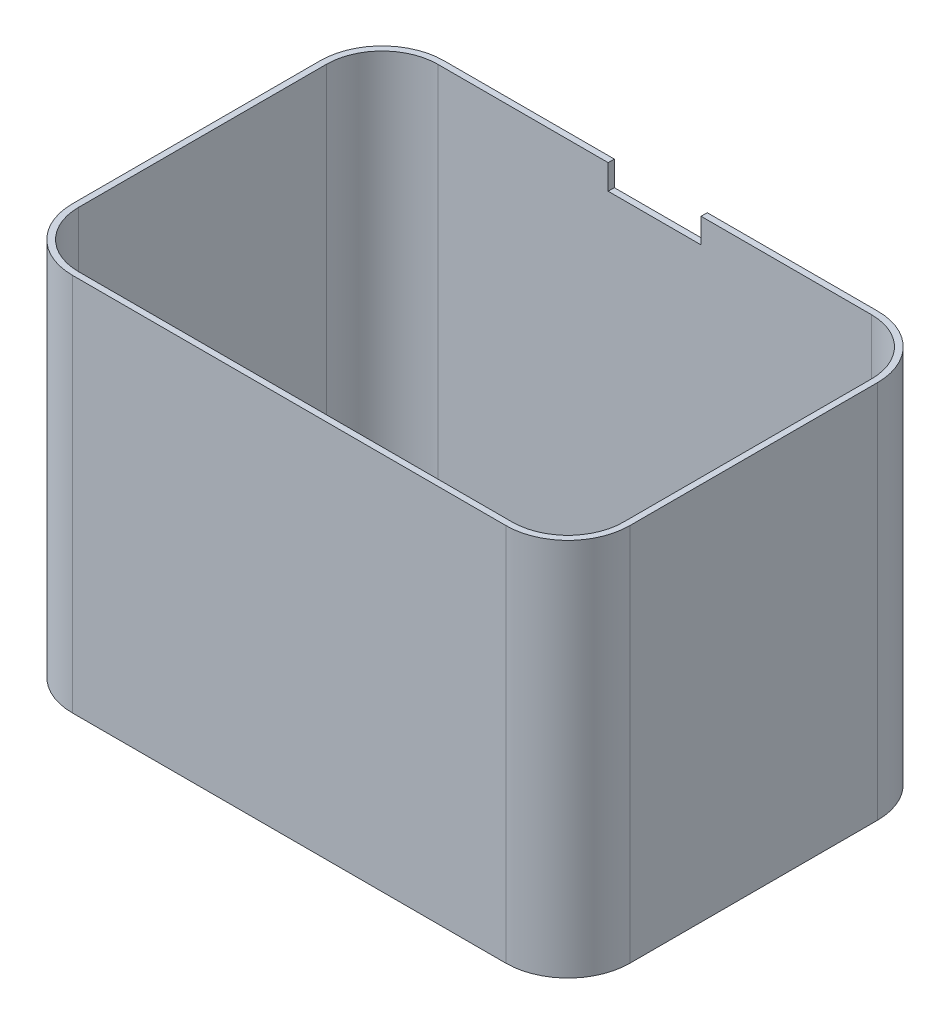
ISO-10303-21;
HEADER;
FILE_DESCRIPTION(('STEP AP214'),'2;1');
FILE_NAME('part.step','',(''),(''),'','','');
FILE_SCHEMA(('AUTOMOTIVE_DESIGN { 1 0 10303 214 1 1 1 1 }'));
ENDSEC;
DATA;
#1=APPLICATION_CONTEXT('core data for automotive mechanical design processes');
#2=APPLICATION_PROTOCOL_DEFINITION('international standard','automotive_design',2000,#1);
#3=PRODUCT_CONTEXT('',#1,'mechanical');
#4=PRODUCT('Part','Part','',(#3));
#5=PRODUCT_RELATED_PRODUCT_CATEGORY('part','',(#4));
#6=PRODUCT_DEFINITION_FORMATION('','',#4);
#7=PRODUCT_DEFINITION_CONTEXT('part definition',#1,'design');
#8=PRODUCT_DEFINITION('design','',#6,#7);
#9=PRODUCT_DEFINITION_SHAPE('','',#8);
#10=(LENGTH_UNIT() NAMED_UNIT(*) SI_UNIT(.MILLI.,.METRE.));
#11=(NAMED_UNIT(*) PLANE_ANGLE_UNIT() SI_UNIT($,.RADIAN.));
#12=(NAMED_UNIT(*) SI_UNIT($,.STERADIAN.) SOLID_ANGLE_UNIT());
#13=UNCERTAINTY_MEASURE_WITH_UNIT(LENGTH_MEASURE(1.E-05),#10,'distance_accuracy_value','');
#14=(GEOMETRIC_REPRESENTATION_CONTEXT(3) GLOBAL_UNCERTAINTY_ASSIGNED_CONTEXT((#13)) GLOBAL_UNIT_ASSIGNED_CONTEXT((#10,
#11,#12)) REPRESENTATION_CONTEXT('',''));
#15=CARTESIAN_POINT('',(0.,0.,0.));
#16=DIRECTION('',(0.,0.,1.));
#17=DIRECTION('',(1.,0.,0.));
#18=AXIS2_PLACEMENT_3D('',#15,#16,#17);
#19=CARTESIAN_POINT('',(-35.,1.2,-20.));
#20=DIRECTION('',(0.,-1.,0.));
#21=DIRECTION('',(0.,0.,-1.));
#22=AXIS2_PLACEMENT_3D('',#19,#20,#21);
#23=CYLINDRICAL_SURFACE('',#22,10.);
#24=CARTESIAN_POINT('',(-35.,0.,-20.));
#25=DIRECTION('',(0.,1.,0.));
#26=DIRECTION('',(0.,0.,1.));
#27=AXIS2_PLACEMENT_3D('',#24,#25,#26);
#28=CIRCLE('',#27,10.);
#29=CARTESIAN_POINT('',(-34.9999999999999,0.,-30.));
#30=VERTEX_POINT('',#29);
#31=CARTESIAN_POINT('',(-45.,0.,-19.9999999999999));
#32=VERTEX_POINT('',#31);
#33=EDGE_CURVE('E282',#30,#32,#28,.T.);
#34=ORIENTED_EDGE('',*,*,#33,.T.);
#35=DIRECTION('',(0.,-1.,0.));
#36=VECTOR('',#35,1.);
#37=CARTESIAN_POINT('',(-45.,1.2,-19.9999999999999));
#38=LINE('',#37,#36);
#39=CARTESIAN_POINT('',(-45.,61.2,-19.9999999999999));
#40=VERTEX_POINT('',#39);
#41=EDGE_CURVE('E320',#40,#32,#38,.T.);
#42=ORIENTED_EDGE('',*,*,#41,.F.);
#43=CARTESIAN_POINT('',(-35.,61.2,-20.));
#44=DIRECTION('',(0.,1.,0.));
#45=DIRECTION('',(0.,0.,1.));
#46=AXIS2_PLACEMENT_3D('',#43,#44,#45);
#47=CIRCLE('',#46,10.);
#48=CARTESIAN_POINT('',(-34.9999999999999,61.2,-30.));
#49=VERTEX_POINT('',#48);
#50=EDGE_CURVE('E264',#49,#40,#47,.T.);
#51=ORIENTED_EDGE('',*,*,#50,.F.);
#52=DIRECTION('',(0.,-1.,0.));
#53=VECTOR('',#52,1.);
#54=CARTESIAN_POINT('',(-34.9999999999999,1.2,-30.));
#55=LINE('',#54,#53);
#56=EDGE_CURVE('E299',#49,#30,#55,.T.);
#57=ORIENTED_EDGE('',*,*,#56,.T.);
#58=EDGE_LOOP('',(#34,#42,#51,#57));
#59=FACE_BOUND('',#58,.T.);
#60=ADVANCED_FACE('F38',(#59),#23,.T.);
#61=CARTESIAN_POINT('',(-45.,1.2,-19.9999999999999));
#62=DIRECTION('',(1.,0.,0.));
#63=DIRECTION('',(0.,0.,-1.));
#64=AXIS2_PLACEMENT_3D('',#61,#62,#63);
#65=PLANE('',#64);
#66=DIRECTION('',(0.,0.,1.));
#67=VECTOR('',#66,1.);
#68=CARTESIAN_POINT('',(-45.,0.,-19.9999999999999));
#69=LINE('',#68,#67);
#70=CARTESIAN_POINT('',(-45.,0.,19.9999999999999));
#71=VERTEX_POINT('',#70);
#72=EDGE_CURVE('E285',#32,#71,#69,.T.);
#73=ORIENTED_EDGE('',*,*,#72,.T.);
#74=DIRECTION('',(0.,-1.,0.));
#75=VECTOR('',#74,1.);
#76=CARTESIAN_POINT('',(-45.,1.2,19.9999999999999));
#77=LINE('',#76,#75);
#78=CARTESIAN_POINT('',(-45.,61.2,19.9999999999999));
#79=VERTEX_POINT('',#78);
#80=EDGE_CURVE('E317',#79,#71,#77,.T.);
#81=ORIENTED_EDGE('',*,*,#80,.F.);
#82=DIRECTION('',(0.,0.,1.));
#83=VECTOR('',#82,1.);
#84=CARTESIAN_POINT('',(-45.,61.2,-19.9999999999999));
#85=LINE('',#84,#83);
#86=EDGE_CURVE('E267',#40,#79,#85,.T.);
#87=ORIENTED_EDGE('',*,*,#86,.F.);
#88=ORIENTED_EDGE('',*,*,#41,.T.);
#89=EDGE_LOOP('',(#73,#81,#87,#88));
#90=FACE_BOUND('',#89,.T.);
#91=ADVANCED_FACE('F381',(#90),#65,.F.);
#92=CARTESIAN_POINT('',(-35.,1.2,20.));
#93=DIRECTION('',(0.,-1.,0.));
#94=DIRECTION('',(0.,0.,-1.));
#95=AXIS2_PLACEMENT_3D('',#92,#93,#94);
#96=CYLINDRICAL_SURFACE('',#95,10.);
#97=CARTESIAN_POINT('',(-35.,0.,20.));
#98=DIRECTION('',(0.,1.,0.));
#99=DIRECTION('',(0.,0.,1.));
#100=AXIS2_PLACEMENT_3D('',#97,#98,#99);
#101=CIRCLE('',#100,10.);
#102=CARTESIAN_POINT('',(-34.9999999999999,0.,30.));
#103=VERTEX_POINT('',#102);
#104=EDGE_CURVE('E287',#71,#103,#101,.T.);
#105=ORIENTED_EDGE('',*,*,#104,.T.);
#106=DIRECTION('',(0.,-1.,0.));
#107=VECTOR('',#106,1.);
#108=CARTESIAN_POINT('',(-34.9999999999999,1.2,30.));
#109=LINE('',#108,#107);
#110=CARTESIAN_POINT('',(-35.,61.2,30.));
#111=VERTEX_POINT('',#110);
#112=EDGE_CURVE('E314',#111,#103,#109,.T.);
#113=ORIENTED_EDGE('',*,*,#112,.F.);
#114=CARTESIAN_POINT('',(-35.,61.2,20.));
#115=DIRECTION('',(0.,1.,0.));
#116=DIRECTION('',(0.,0.,1.));
#117=AXIS2_PLACEMENT_3D('',#114,#115,#116);
#118=CIRCLE('',#117,9.99999999999999);
#119=EDGE_CURVE('E270',#79,#111,#118,.T.);
#120=ORIENTED_EDGE('',*,*,#119,.F.);
#121=ORIENTED_EDGE('',*,*,#80,.T.);
#122=EDGE_LOOP('',(#105,#113,#120,#121));
#123=FACE_BOUND('',#122,.T.);
#124=ADVANCED_FACE('F387',(#123),#96,.T.);
#125=CARTESIAN_POINT('',(-34.9999999999999,1.2,30.));
#126=DIRECTION('',(0.,0.,-1.));
#127=DIRECTION('',(-1.,0.,0.));
#128=AXIS2_PLACEMENT_3D('',#125,#126,#127);
#129=PLANE('',#128);
#130=DIRECTION('',(1.,0.,0.));
#131=VECTOR('',#130,1.);
#132=CARTESIAN_POINT('',(-34.9999999999999,0.,30.));
#133=LINE('',#132,#131);
#134=CARTESIAN_POINT('',(34.9999999999999,0.,30.));
#135=VERTEX_POINT('',#134);
#136=EDGE_CURVE('E289',#103,#135,#133,.T.);
#137=ORIENTED_EDGE('',*,*,#136,.T.);
#138=DIRECTION('',(0.,-1.,0.));
#139=VECTOR('',#138,1.);
#140=CARTESIAN_POINT('',(34.9999999999999,1.2,30.));
#141=LINE('',#140,#139);
#142=CARTESIAN_POINT('',(34.9999999999999,61.2,30.));
#143=VERTEX_POINT('',#142);
#144=EDGE_CURVE('E311',#143,#135,#141,.T.);
#145=ORIENTED_EDGE('',*,*,#144,.F.);
#146=DIRECTION('',(1.,0.,0.));
#147=VECTOR('',#146,1.);
#148=CARTESIAN_POINT('',(-35.,61.2,30.));
#149=LINE('',#148,#147);
#150=EDGE_CURVE('E273',#111,#143,#149,.T.);
#151=ORIENTED_EDGE('',*,*,#150,.F.);
#152=ORIENTED_EDGE('',*,*,#112,.T.);
#153=EDGE_LOOP('',(#137,#145,#151,#152));
#154=FACE_BOUND('',#153,.T.);
#155=ADVANCED_FACE('F403',(#154),#129,.F.);
#156=CARTESIAN_POINT('',(35.,1.2,20.));
#157=DIRECTION('',(0.,-1.,0.));
#158=DIRECTION('',(0.,0.,-1.));
#159=AXIS2_PLACEMENT_3D('',#156,#157,#158);
#160=CYLINDRICAL_SURFACE('',#159,10.);
#161=CARTESIAN_POINT('',(35.,0.,20.));
#162=DIRECTION('',(0.,1.,0.));
#163=DIRECTION('',(0.,0.,1.));
#164=AXIS2_PLACEMENT_3D('',#161,#162,#163);
#165=CIRCLE('',#164,10.);
#166=CARTESIAN_POINT('',(45.,0.,19.9999999999999));
#167=VERTEX_POINT('',#166);
#168=EDGE_CURVE('E291',#135,#167,#165,.T.);
#169=ORIENTED_EDGE('',*,*,#168,.T.);
#170=DIRECTION('',(0.,-1.,0.));
#171=VECTOR('',#170,1.);
#172=CARTESIAN_POINT('',(45.,1.2,19.9999999999999));
#173=LINE('',#172,#171);
#174=CARTESIAN_POINT('',(45.,61.2,20.));
#175=VERTEX_POINT('',#174);
#176=EDGE_CURVE('E308',#175,#167,#173,.T.);
#177=ORIENTED_EDGE('',*,*,#176,.F.);
#178=CARTESIAN_POINT('',(35.,61.2,20.));
#179=DIRECTION('',(0.,1.,0.));
#180=DIRECTION('',(0.,0.,1.));
#181=AXIS2_PLACEMENT_3D('',#178,#179,#180);
#182=CIRCLE('',#181,10.);
#183=EDGE_CURVE('E276',#143,#175,#182,.T.);
#184=ORIENTED_EDGE('',*,*,#183,.F.);
#185=ORIENTED_EDGE('',*,*,#144,.T.);
#186=EDGE_LOOP('',(#169,#177,#184,#185));
#187=FACE_BOUND('',#186,.T.);
#188=ADVANCED_FACE('F407',(#187),#160,.T.);
#189=CARTESIAN_POINT('',(45.,1.2,-19.9999999999999));
#190=DIRECTION('',(-1.,0.,0.));
#191=DIRECTION('',(0.,0.,1.));
#192=AXIS2_PLACEMENT_3D('',#189,#190,#191);
#193=PLANE('',#192);
#194=DIRECTION('',(0.,0.,-1.));
#195=VECTOR('',#194,1.);
#196=CARTESIAN_POINT('',(45.,0.,-19.9999999999999));
#197=LINE('',#196,#195);
#198=CARTESIAN_POINT('',(45.,0.,-19.9999999999999));
#199=VERTEX_POINT('',#198);
#200=EDGE_CURVE('E293',#167,#199,#197,.T.);
#201=ORIENTED_EDGE('',*,*,#200,.T.);
#202=DIRECTION('',(0.,-1.,0.));
#203=VECTOR('',#202,1.);
#204=CARTESIAN_POINT('',(45.,1.2,-19.9999999999999));
#205=LINE('',#204,#203);
#206=CARTESIAN_POINT('',(45.,61.2,-19.9999999999999));
#207=VERTEX_POINT('',#206);
#208=EDGE_CURVE('E305',#207,#199,#205,.T.);
#209=ORIENTED_EDGE('',*,*,#208,.F.);
#210=DIRECTION('',(0.,0.,-1.));
#211=VECTOR('',#210,1.);
#212=CARTESIAN_POINT('',(45.,61.2,20.));
#213=LINE('',#212,#211);
#214=EDGE_CURVE('E279',#175,#207,#213,.T.);
#215=ORIENTED_EDGE('',*,*,#214,.F.);
#216=ORIENTED_EDGE('',*,*,#176,.T.);
#217=EDGE_LOOP('',(#201,#209,#215,#216));
#218=FACE_BOUND('',#217,.T.);
#219=ADVANCED_FACE('F411',(#218),#193,.F.);
#220=CARTESIAN_POINT('',(35.,1.2,-20.));
#221=DIRECTION('',(0.,-1.,0.));
#222=DIRECTION('',(0.,0.,-1.));
#223=AXIS2_PLACEMENT_3D('',#220,#221,#222);
#224=CYLINDRICAL_SURFACE('',#223,10.);
#225=CARTESIAN_POINT('',(35.,0.,-20.));
#226=DIRECTION('',(0.,1.,0.));
#227=DIRECTION('',(0.,0.,-1.));
#228=AXIS2_PLACEMENT_3D('',#225,#226,#227);
#229=CIRCLE('',#228,10.);
#230=CARTESIAN_POINT('',(34.9999999999999,0.,-30.));
#231=VERTEX_POINT('',#230);
#232=EDGE_CURVE('E295',#199,#231,#229,.T.);
#233=ORIENTED_EDGE('',*,*,#232,.T.);
#234=DIRECTION('',(0.,-1.,0.));
#235=VECTOR('',#234,1.);
#236=CARTESIAN_POINT('',(34.9999999999999,1.2,-30.));
#237=LINE('',#236,#235);
#238=CARTESIAN_POINT('',(34.9999999999999,61.2,-30.));
#239=VERTEX_POINT('',#238);
#240=EDGE_CURVE('E302',#239,#231,#237,.T.);
#241=ORIENTED_EDGE('',*,*,#240,.F.);
#242=CARTESIAN_POINT('',(35.,61.2,-20.));
#243=DIRECTION('',(0.,1.,0.));
#244=DIRECTION('',(0.,0.,1.));
#245=AXIS2_PLACEMENT_3D('',#242,#243,#244);
#246=CIRCLE('',#245,10.);
#247=EDGE_CURVE('E258',#207,#239,#246,.T.);
#248=ORIENTED_EDGE('',*,*,#247,.F.);
#249=ORIENTED_EDGE('',*,*,#208,.T.);
#250=EDGE_LOOP('',(#233,#241,#248,#249));
#251=FACE_BOUND('',#250,.T.);
#252=ADVANCED_FACE('F414',(#251),#224,.T.);
#253=CARTESIAN_POINT('',(-34.9999999999999,1.2,-30.));
#254=DIRECTION('',(0.,0.,1.));
#255=DIRECTION('',(1.,0.,0.));
#256=AXIS2_PLACEMENT_3D('',#253,#254,#255);
#257=PLANE('',#256);
#258=DIRECTION('',(-1.,0.,0.));
#259=VECTOR('',#258,1.);
#260=CARTESIAN_POINT('',(34.9999999999999,61.2,-30.));
#261=LINE('',#260,#259);
#262=CARTESIAN_POINT('',(-7.5,61.2,-30.));
#263=VERTEX_POINT('',#262);
#264=EDGE_CURVE('E261',#263,#49,#261,.T.);
#265=ORIENTED_EDGE('',*,*,#264,.F.);
#266=DIRECTION('',(0.,1.,0.));
#267=VECTOR('',#266,1.);
#268=CARTESIAN_POINT('',(-7.5,65.2,-30.));
#269=LINE('',#268,#267);
#270=CARTESIAN_POINT('',(-7.5,57.2,-30.));
#271=VERTEX_POINT('',#270);
#272=EDGE_CURVE('E189',#271,#263,#269,.T.);
#273=ORIENTED_EDGE('',*,*,#272,.F.);
#274=DIRECTION('',(-1.,0.,0.));
#275=VECTOR('',#274,1.);
#276=CARTESIAN_POINT('',(7.5,57.2,-30.));
#277=LINE('',#276,#275);
#278=CARTESIAN_POINT('',(7.5,57.2,-30.));
#279=VERTEX_POINT('',#278);
#280=EDGE_CURVE('E175',#279,#271,#277,.T.);
#281=ORIENTED_EDGE('',*,*,#280,.F.);
#282=DIRECTION('',(0.,-1.,0.));
#283=VECTOR('',#282,1.);
#284=CARTESIAN_POINT('',(7.5,65.2,-30.));
#285=LINE('',#284,#283);
#286=CARTESIAN_POINT('',(7.5,61.2,-30.));
#287=VERTEX_POINT('',#286);
#288=EDGE_CURVE('E182',#287,#279,#285,.T.);
#289=ORIENTED_EDGE('',*,*,#288,.F.);
#290=EDGE_CURVE('E262',#239,#287,#261,.T.);
#291=ORIENTED_EDGE('',*,*,#290,.F.);
#292=ORIENTED_EDGE('',*,*,#240,.T.);
#293=DIRECTION('',(-1.,0.,0.));
#294=VECTOR('',#293,1.);
#295=CARTESIAN_POINT('',(-34.9999999999999,0.,-30.));
#296=LINE('',#295,#294);
#297=EDGE_CURVE('E297',#231,#30,#296,.T.);
#298=ORIENTED_EDGE('',*,*,#297,.T.);
#299=ORIENTED_EDGE('',*,*,#56,.F.);
#300=EDGE_LOOP('',(#265,#273,#281,#289,#291,#292,#298,#299));
#301=FACE_BOUND('',#300,.T.);
#302=ADVANCED_FACE('F192',(#301),#257,.F.);
#303=CARTESIAN_POINT('',(-35.,0.,-20.));
#304=DIRECTION('',(0.,1.,0.));
#305=DIRECTION('',(0.,0.,1.));
#306=AXIS2_PLACEMENT_3D('',#303,#304,#305);
#307=PLANE('',#306);
#308=ORIENTED_EDGE('',*,*,#33,.F.);
#309=ORIENTED_EDGE('',*,*,#297,.F.);
#310=ORIENTED_EDGE('',*,*,#232,.F.);
#311=ORIENTED_EDGE('',*,*,#200,.F.);
#312=ORIENTED_EDGE('',*,*,#168,.F.);
#313=ORIENTED_EDGE('',*,*,#136,.F.);
#314=ORIENTED_EDGE('',*,*,#104,.F.);
#315=ORIENTED_EDGE('',*,*,#72,.F.);
#316=EDGE_LOOP('',(#308,#309,#310,#311,#312,#313,#314,#315));
#317=FACE_BOUND('',#316,.T.);
#318=ADVANCED_FACE('F394',(#317),#307,.F.);
#319=CARTESIAN_POINT('',(35.,61.2,-20.));
#320=DIRECTION('',(0.,1.,0.));
#321=DIRECTION('',(0.,0.,1.));
#322=AXIS2_PLACEMENT_3D('',#319,#320,#321);
#323=PLANE('',#322);
#324=DIRECTION('',(0.,0.,1.));
#325=VECTOR('',#324,1.);
#326=CARTESIAN_POINT('',(-7.5,61.2,-20.));
#327=LINE('',#326,#325);
#328=CARTESIAN_POINT('',(-7.5,61.2,-29.));
#329=VERTEX_POINT('',#328);
#330=EDGE_CURVE('E198',#263,#329,#327,.T.);
#331=ORIENTED_EDGE('',*,*,#330,.F.);
#332=ORIENTED_EDGE('',*,*,#264,.T.);
#333=ORIENTED_EDGE('',*,*,#50,.T.);
#334=ORIENTED_EDGE('',*,*,#86,.T.);
#335=ORIENTED_EDGE('',*,*,#119,.T.);
#336=ORIENTED_EDGE('',*,*,#150,.T.);
#337=ORIENTED_EDGE('',*,*,#183,.T.);
#338=ORIENTED_EDGE('',*,*,#214,.T.);
#339=ORIENTED_EDGE('',*,*,#247,.T.);
#340=ORIENTED_EDGE('',*,*,#290,.T.);
#341=DIRECTION('',(0.,0.,-1.));
#342=VECTOR('',#341,1.);
#343=CARTESIAN_POINT('',(7.5,61.2,-20.));
#344=LINE('',#343,#342);
#345=CARTESIAN_POINT('',(7.5,61.2,-29.));
#346=VERTEX_POINT('',#345);
#347=EDGE_CURVE('E185',#346,#287,#344,.T.);
#348=ORIENTED_EDGE('',*,*,#347,.F.);
#349=DIRECTION('',(-1.,0.,0.));
#350=VECTOR('',#349,1.);
#351=CARTESIAN_POINT('',(34.9999999999999,61.2,-29.));
#352=LINE('',#351,#350);
#353=CARTESIAN_POINT('',(34.9999999999999,61.2,-29.));
#354=VERTEX_POINT('',#353);
#355=EDGE_CURVE('E204',#354,#346,#352,.T.);
#356=ORIENTED_EDGE('',*,*,#355,.F.);
#357=CARTESIAN_POINT('',(35.,61.2,-20.));
#358=DIRECTION('',(0.,1.,0.));
#359=DIRECTION('',(0.,0.,1.));
#360=AXIS2_PLACEMENT_3D('',#357,#358,#359);
#361=CIRCLE('',#360,9.);
#362=CARTESIAN_POINT('',(44.,61.2,-19.9999999999999));
#363=VERTEX_POINT('',#362);
#364=EDGE_CURVE('E200',#363,#354,#361,.T.);
#365=ORIENTED_EDGE('',*,*,#364,.F.);
#366=DIRECTION('',(0.,0.,-1.));
#367=VECTOR('',#366,1.);
#368=CARTESIAN_POINT('',(44.,61.2,20.));
#369=LINE('',#368,#367);
#370=CARTESIAN_POINT('',(44.,61.2,20.));
#371=VERTEX_POINT('',#370);
#372=EDGE_CURVE('E218',#371,#363,#369,.T.);
#373=ORIENTED_EDGE('',*,*,#372,.F.);
#374=CARTESIAN_POINT('',(35.,61.2,20.));
#375=DIRECTION('',(0.,1.,0.));
#376=DIRECTION('',(0.,0.,1.));
#377=AXIS2_PLACEMENT_3D('',#374,#375,#376);
#378=CIRCLE('',#377,9.);
#379=CARTESIAN_POINT('',(34.9999999999999,61.2,29.));
#380=VERTEX_POINT('',#379);
#381=EDGE_CURVE('E215',#380,#371,#378,.T.);
#382=ORIENTED_EDGE('',*,*,#381,.F.);
#383=DIRECTION('',(1.,0.,0.));
#384=VECTOR('',#383,1.);
#385=CARTESIAN_POINT('',(-35.,61.2,29.));
#386=LINE('',#385,#384);
#387=CARTESIAN_POINT('',(-35.,61.2,29.));
#388=VERTEX_POINT('',#387);
#389=EDGE_CURVE('E213',#388,#380,#386,.T.);
#390=ORIENTED_EDGE('',*,*,#389,.F.);
#391=CARTESIAN_POINT('',(-35.,61.2,20.));
#392=DIRECTION('',(0.,1.,0.));
#393=DIRECTION('',(0.,0.,1.));
#394=AXIS2_PLACEMENT_3D('',#391,#392,#393);
#395=CIRCLE('',#394,9.);
#396=CARTESIAN_POINT('',(-44.,61.2,19.9999999999999));
#397=VERTEX_POINT('',#396);
#398=EDGE_CURVE('E211',#397,#388,#395,.T.);
#399=ORIENTED_EDGE('',*,*,#398,.F.);
#400=DIRECTION('',(0.,0.,1.));
#401=VECTOR('',#400,1.);
#402=CARTESIAN_POINT('',(-44.,61.2,-19.9999999999999));
#403=LINE('',#402,#401);
#404=CARTESIAN_POINT('',(-44.,61.2,-19.9999999999999));
#405=VERTEX_POINT('',#404);
#406=EDGE_CURVE('E209',#405,#397,#403,.T.);
#407=ORIENTED_EDGE('',*,*,#406,.F.);
#408=CARTESIAN_POINT('',(-35.,61.2,-20.));
#409=DIRECTION('',(0.,1.,0.));
#410=DIRECTION('',(0.,0.,1.));
#411=AXIS2_PLACEMENT_3D('',#408,#409,#410);
#412=CIRCLE('',#411,9.);
#413=CARTESIAN_POINT('',(-35.,61.2,-29.));
#414=VERTEX_POINT('',#413);
#415=EDGE_CURVE('E207',#414,#405,#412,.T.);
#416=ORIENTED_EDGE('',*,*,#415,.F.);
#417=EDGE_CURVE('E202',#329,#414,#352,.T.);
#418=ORIENTED_EDGE('',*,*,#417,.F.);
#419=EDGE_LOOP('',(#331,#332,#333,#334,#335,#336,#337,#338,#339,#340,#348,#356,#365,#373,#382,
#390,#399,#407,#416,#418));
#420=FACE_BOUND('',#419,.T.);
#421=ADVANCED_FACE('F328',(#420),#323,.T.);
#422=CARTESIAN_POINT('',(35.,61.2,-20.));
#423=DIRECTION('',(0.,-1.,0.));
#424=DIRECTION('',(0.,0.,-1.));
#425=AXIS2_PLACEMENT_3D('',#422,#423,#424);
#426=CYLINDRICAL_SURFACE('',#425,9.);
#427=CARTESIAN_POINT('',(35.,1.2,-20.));
#428=DIRECTION('',(0.,1.,0.));
#429=DIRECTION('',(0.,0.,1.));
#430=AXIS2_PLACEMENT_3D('',#427,#428,#429);
#431=CIRCLE('',#430,9.);
#432=CARTESIAN_POINT('',(44.,1.2,-19.9999999999999));
#433=VERTEX_POINT('',#432);
#434=CARTESIAN_POINT('',(34.9999999999999,1.2,-29.));
#435=VERTEX_POINT('',#434);
#436=EDGE_CURVE('E60',#433,#435,#431,.T.);
#437=ORIENTED_EDGE('',*,*,#436,.F.);
#438=DIRECTION('',(0.,-1.,0.));
#439=VECTOR('',#438,1.);
#440=CARTESIAN_POINT('',(44.,61.2,-19.9999999999999));
#441=LINE('',#440,#439);
#442=EDGE_CURVE('E220',#363,#433,#441,.T.);
#443=ORIENTED_EDGE('',*,*,#442,.F.);
#444=ORIENTED_EDGE('',*,*,#364,.T.);
#445=DIRECTION('',(0.,-1.,0.));
#446=VECTOR('',#445,1.);
#447=CARTESIAN_POINT('',(34.9999999999999,61.2,-29.));
#448=LINE('',#447,#446);
#449=EDGE_CURVE('E255',#354,#435,#448,.T.);
#450=ORIENTED_EDGE('',*,*,#449,.T.);
#451=EDGE_LOOP('',(#437,#443,#444,#450));
#452=FACE_BOUND('',#451,.T.);
#453=ADVANCED_FACE('F334',(#452),#426,.F.);
#454=CARTESIAN_POINT('',(34.9999999999999,61.2,-29.));
#455=DIRECTION('',(0.,0.,1.));
#456=DIRECTION('',(1.,0.,0.));
#457=AXIS2_PLACEMENT_3D('',#454,#455,#456);
#458=PLANE('',#457);
#459=DIRECTION('',(0.,-1.,0.));
#460=VECTOR('',#459,1.);
#461=CARTESIAN_POINT('',(-7.5,61.2,-29.));
#462=LINE('',#461,#460);
#463=CARTESIAN_POINT('',(-7.5,57.2,-29.));
#464=VERTEX_POINT('',#463);
#465=EDGE_CURVE('E11',#329,#464,#462,.T.);
#466=ORIENTED_EDGE('',*,*,#465,.F.);
#467=ORIENTED_EDGE('',*,*,#417,.T.);
#468=DIRECTION('',(0.,-1.,0.));
#469=VECTOR('',#468,1.);
#470=CARTESIAN_POINT('',(-35.,61.2,-29.));
#471=LINE('',#470,#469);
#472=CARTESIAN_POINT('',(-35.,1.2,-29.));
#473=VERTEX_POINT('',#472);
#474=EDGE_CURVE('E252',#414,#473,#471,.T.);
#475=ORIENTED_EDGE('',*,*,#474,.T.);
#476=DIRECTION('',(-1.,0.,0.));
#477=VECTOR('',#476,1.);
#478=CARTESIAN_POINT('',(34.9999999999999,1.2,-29.));
#479=LINE('',#478,#477);
#480=EDGE_CURVE('E222',#435,#473,#479,.T.);
#481=ORIENTED_EDGE('',*,*,#480,.F.);
#482=ORIENTED_EDGE('',*,*,#449,.F.);
#483=ORIENTED_EDGE('',*,*,#355,.T.);
#484=DIRECTION('',(0.,1.,0.));
#485=VECTOR('',#484,1.);
#486=CARTESIAN_POINT('',(7.5,61.2,-29.));
#487=LINE('',#486,#485);
#488=CARTESIAN_POINT('',(7.5,57.2,-29.));
#489=VERTEX_POINT('',#488);
#490=EDGE_CURVE('E323',#489,#346,#487,.T.);
#491=ORIENTED_EDGE('',*,*,#490,.F.);
#492=DIRECTION('',(1.,0.,0.));
#493=VECTOR('',#492,1.);
#494=CARTESIAN_POINT('',(34.9999999999999,57.2,-29.));
#495=LINE('',#494,#493);
#496=EDGE_CURVE('E45',#464,#489,#495,.T.);
#497=ORIENTED_EDGE('',*,*,#496,.F.);
#498=EDGE_LOOP('',(#466,#467,#475,#481,#482,#483,#491,#497));
#499=FACE_BOUND('',#498,.T.);
#500=ADVANCED_FACE('F332',(#499),#458,.T.);
#501=CARTESIAN_POINT('',(-35.,61.2,-20.));
#502=DIRECTION('',(0.,-1.,0.));
#503=DIRECTION('',(0.,0.,-1.));
#504=AXIS2_PLACEMENT_3D('',#501,#502,#503);
#505=CYLINDRICAL_SURFACE('',#504,9.);
#506=CARTESIAN_POINT('',(-35.,1.2,-20.));
#507=DIRECTION('',(0.,1.,0.));
#508=DIRECTION('',(0.,0.,1.));
#509=AXIS2_PLACEMENT_3D('',#506,#507,#508);
#510=CIRCLE('',#509,9.);
#511=CARTESIAN_POINT('',(-44.,1.2,-19.9999999999999));
#512=VERTEX_POINT('',#511);
#513=EDGE_CURVE('E224',#473,#512,#510,.T.);
#514=ORIENTED_EDGE('',*,*,#513,.F.);
#515=ORIENTED_EDGE('',*,*,#474,.F.);
#516=ORIENTED_EDGE('',*,*,#415,.T.);
#517=DIRECTION('',(0.,-1.,0.));
#518=VECTOR('',#517,1.);
#519=CARTESIAN_POINT('',(-44.,61.2,-19.9999999999999));
#520=LINE('',#519,#518);
#521=EDGE_CURVE('E249',#405,#512,#520,.T.);
#522=ORIENTED_EDGE('',*,*,#521,.T.);
#523=EDGE_LOOP('',(#514,#515,#516,#522));
#524=FACE_BOUND('',#523,.T.);
#525=ADVANCED_FACE('F363',(#524),#505,.F.);
#526=CARTESIAN_POINT('',(-44.,61.2,-19.9999999999999));
#527=DIRECTION('',(1.,0.,0.));
#528=DIRECTION('',(0.,0.,-1.));
#529=AXIS2_PLACEMENT_3D('',#526,#527,#528);
#530=PLANE('',#529);
#531=DIRECTION('',(0.,0.,1.));
#532=VECTOR('',#531,1.);
#533=CARTESIAN_POINT('',(-44.,1.2,-19.9999999999999));
#534=LINE('',#533,#532);
#535=CARTESIAN_POINT('',(-44.,1.2,19.9999999999999));
#536=VERTEX_POINT('',#535);
#537=EDGE_CURVE('E226',#512,#536,#534,.T.);
#538=ORIENTED_EDGE('',*,*,#537,.F.);
#539=ORIENTED_EDGE('',*,*,#521,.F.);
#540=ORIENTED_EDGE('',*,*,#406,.T.);
#541=DIRECTION('',(0.,-1.,0.));
#542=VECTOR('',#541,1.);
#543=CARTESIAN_POINT('',(-44.,61.2,19.9999999999999));
#544=LINE('',#543,#542);
#545=EDGE_CURVE('E246',#397,#536,#544,.T.);
#546=ORIENTED_EDGE('',*,*,#545,.T.);
#547=EDGE_LOOP('',(#538,#539,#540,#546));
#548=FACE_BOUND('',#547,.T.);
#549=ADVANCED_FACE('F359',(#548),#530,.T.);
#550=CARTESIAN_POINT('',(-35.,61.2,20.));
#551=DIRECTION('',(0.,-1.,0.));
#552=DIRECTION('',(0.,0.,-1.));
#553=AXIS2_PLACEMENT_3D('',#550,#551,#552);
#554=CYLINDRICAL_SURFACE('',#553,9.);
#555=CARTESIAN_POINT('',(-35.,1.2,20.));
#556=DIRECTION('',(0.,1.,0.));
#557=DIRECTION('',(0.,0.,1.));
#558=AXIS2_PLACEMENT_3D('',#555,#556,#557);
#559=CIRCLE('',#558,9.);
#560=CARTESIAN_POINT('',(-35.,1.2,29.));
#561=VERTEX_POINT('',#560);
#562=EDGE_CURVE('E228',#536,#561,#559,.T.);
#563=ORIENTED_EDGE('',*,*,#562,.F.);
#564=ORIENTED_EDGE('',*,*,#545,.F.);
#565=ORIENTED_EDGE('',*,*,#398,.T.);
#566=DIRECTION('',(0.,-1.,0.));
#567=VECTOR('',#566,1.);
#568=CARTESIAN_POINT('',(-35.,61.2,29.));
#569=LINE('',#568,#567);
#570=EDGE_CURVE('E243',#388,#561,#569,.T.);
#571=ORIENTED_EDGE('',*,*,#570,.T.);
#572=EDGE_LOOP('',(#563,#564,#565,#571));
#573=FACE_BOUND('',#572,.T.);
#574=ADVANCED_FACE('F356',(#573),#554,.F.);
#575=CARTESIAN_POINT('',(-35.,61.2,29.));
#576=DIRECTION('',(0.,0.,-1.));
#577=DIRECTION('',(-1.,0.,0.));
#578=AXIS2_PLACEMENT_3D('',#575,#576,#577);
#579=PLANE('',#578);
#580=DIRECTION('',(1.,0.,0.));
#581=VECTOR('',#580,1.);
#582=CARTESIAN_POINT('',(-35.,1.2,29.));
#583=LINE('',#582,#581);
#584=CARTESIAN_POINT('',(35.,1.2,29.));
#585=VERTEX_POINT('',#584);
#586=EDGE_CURVE('E230',#561,#585,#583,.T.);
#587=ORIENTED_EDGE('',*,*,#586,.F.);
#588=ORIENTED_EDGE('',*,*,#570,.F.);
#589=ORIENTED_EDGE('',*,*,#389,.T.);
#590=DIRECTION('',(0.,-1.,0.));
#591=VECTOR('',#590,1.);
#592=CARTESIAN_POINT('',(34.9999999999999,61.2,29.));
#593=LINE('',#592,#591);
#594=EDGE_CURVE('E240',#380,#585,#593,.T.);
#595=ORIENTED_EDGE('',*,*,#594,.T.);
#596=EDGE_LOOP('',(#587,#588,#589,#595));
#597=FACE_BOUND('',#596,.T.);
#598=ADVANCED_FACE('F348',(#597),#579,.T.);
#599=CARTESIAN_POINT('',(35.,61.2,20.));
#600=DIRECTION('',(0.,-1.,0.));
#601=DIRECTION('',(0.,0.,-1.));
#602=AXIS2_PLACEMENT_3D('',#599,#600,#601);
#603=CYLINDRICAL_SURFACE('',#602,9.);
#604=CARTESIAN_POINT('',(35.,1.2,20.));
#605=DIRECTION('',(0.,1.,0.));
#606=DIRECTION('',(0.,0.,1.));
#607=AXIS2_PLACEMENT_3D('',#604,#605,#606);
#608=CIRCLE('',#607,9.);
#609=CARTESIAN_POINT('',(44.,1.2,20.));
#610=VERTEX_POINT('',#609);
#611=EDGE_CURVE('E232',#585,#610,#608,.T.);
#612=ORIENTED_EDGE('',*,*,#611,.F.);
#613=ORIENTED_EDGE('',*,*,#594,.F.);
#614=ORIENTED_EDGE('',*,*,#381,.T.);
#615=DIRECTION('',(0.,-1.,0.));
#616=VECTOR('',#615,1.);
#617=CARTESIAN_POINT('',(44.,61.2,20.));
#618=LINE('',#617,#616);
#619=EDGE_CURVE('E237',#371,#610,#618,.T.);
#620=ORIENTED_EDGE('',*,*,#619,.T.);
#621=EDGE_LOOP('',(#612,#613,#614,#620));
#622=FACE_BOUND('',#621,.T.);
#623=ADVANCED_FACE('F345',(#622),#603,.F.);
#624=CARTESIAN_POINT('',(44.,61.2,20.));
#625=DIRECTION('',(-1.,0.,0.));
#626=DIRECTION('',(0.,0.,1.));
#627=AXIS2_PLACEMENT_3D('',#624,#625,#626);
#628=PLANE('',#627);
#629=DIRECTION('',(0.,0.,-1.));
#630=VECTOR('',#629,1.);
#631=CARTESIAN_POINT('',(44.,1.2,20.));
#632=LINE('',#631,#630);
#633=EDGE_CURVE('E203',#610,#433,#632,.T.);
#634=ORIENTED_EDGE('',*,*,#633,.F.);
#635=ORIENTED_EDGE('',*,*,#619,.F.);
#636=ORIENTED_EDGE('',*,*,#372,.T.);
#637=ORIENTED_EDGE('',*,*,#442,.T.);
#638=EDGE_LOOP('',(#634,#635,#636,#637));
#639=FACE_BOUND('',#638,.T.);
#640=ADVANCED_FACE('F341',(#639),#628,.T.);
#641=CARTESIAN_POINT('',(-35.,1.2,-20.));
#642=DIRECTION('',(0.,1.,0.));
#643=DIRECTION('',(0.,0.,1.));
#644=AXIS2_PLACEMENT_3D('',#641,#642,#643);
#645=PLANE('',#644);
#646=ORIENTED_EDGE('',*,*,#436,.T.);
#647=ORIENTED_EDGE('',*,*,#480,.T.);
#648=ORIENTED_EDGE('',*,*,#513,.T.);
#649=ORIENTED_EDGE('',*,*,#537,.T.);
#650=ORIENTED_EDGE('',*,*,#562,.T.);
#651=ORIENTED_EDGE('',*,*,#586,.T.);
#652=ORIENTED_EDGE('',*,*,#611,.T.);
#653=ORIENTED_EDGE('',*,*,#633,.T.);
#654=EDGE_LOOP('',(#646,#647,#648,#649,#650,#651,#652,#653));
#655=FACE_BOUND('',#654,.T.);
#656=ADVANCED_FACE('F369',(#655),#645,.T.);
#657=CARTESIAN_POINT('',(-7.5,65.2,-28.5));
#658=DIRECTION('',(-1.,0.,0.));
#659=DIRECTION('',(0.,-1.,0.));
#660=AXIS2_PLACEMENT_3D('',#657,#658,#659);
#661=PLANE('',#660);
#662=ORIENTED_EDGE('',*,*,#330,.T.);
#663=ORIENTED_EDGE('',*,*,#465,.T.);
#664=DIRECTION('',(0.,0.,-1.));
#665=VECTOR('',#664,1.);
#666=CARTESIAN_POINT('',(-7.5,57.2,-28.5));
#667=LINE('',#666,#665);
#668=EDGE_CURVE('E179',#464,#271,#667,.T.);
#669=ORIENTED_EDGE('',*,*,#668,.T.);
#670=ORIENTED_EDGE('',*,*,#272,.T.);
#671=EDGE_LOOP('',(#662,#663,#669,#670));
#672=FACE_BOUND('',#671,.T.);
#673=ADVANCED_FACE('F367',(#672),#661,.F.);
#674=CARTESIAN_POINT('',(7.5,57.2,-28.5));
#675=DIRECTION('',(0.,-1.,0.));
#676=DIRECTION('',(0.,0.,-1.));
#677=AXIS2_PLACEMENT_3D('',#674,#675,#676);
#678=PLANE('',#677);
#679=ORIENTED_EDGE('',*,*,#496,.T.);
#680=DIRECTION('',(0.,0.,-1.));
#681=VECTOR('',#680,1.);
#682=CARTESIAN_POINT('',(7.5,57.2,-28.5));
#683=LINE('',#682,#681);
#684=EDGE_CURVE('E52',#489,#279,#683,.T.);
#685=ORIENTED_EDGE('',*,*,#684,.T.);
#686=ORIENTED_EDGE('',*,*,#280,.T.);
#687=ORIENTED_EDGE('',*,*,#668,.F.);
#688=EDGE_LOOP('',(#679,#685,#686,#687));
#689=FACE_BOUND('',#688,.T.);
#690=ADVANCED_FACE('F172',(#689),#678,.F.);
#691=CARTESIAN_POINT('',(7.5,65.2,-28.5));
#692=DIRECTION('',(1.,0.,0.));
#693=DIRECTION('',(0.,1.,0.));
#694=AXIS2_PLACEMENT_3D('',#691,#692,#693);
#695=PLANE('',#694);
#696=ORIENTED_EDGE('',*,*,#347,.T.);
#697=ORIENTED_EDGE('',*,*,#288,.T.);
#698=ORIENTED_EDGE('',*,*,#684,.F.);
#699=ORIENTED_EDGE('',*,*,#490,.T.);
#700=EDGE_LOOP('',(#696,#697,#698,#699));
#701=FACE_BOUND('',#700,.T.);
#702=ADVANCED_FACE('F183',(#701),#695,.F.);
#703=CLOSED_SHELL('',(#60,#91,#124,#155,#188,#219,#252,#302,#318,#421,#453,#500,#525,#549,#574,
#598,#623,#640,#656,#673,#690,#702));
#704=MANIFOLD_SOLID_BREP('B2',#703);
#705=ADVANCED_BREP_SHAPE_REPRESENTATION('',(#18,#704),#14);
#706=SHAPE_DEFINITION_REPRESENTATION(#9,#705);
ENDSEC;
END-ISO-10303-21;
